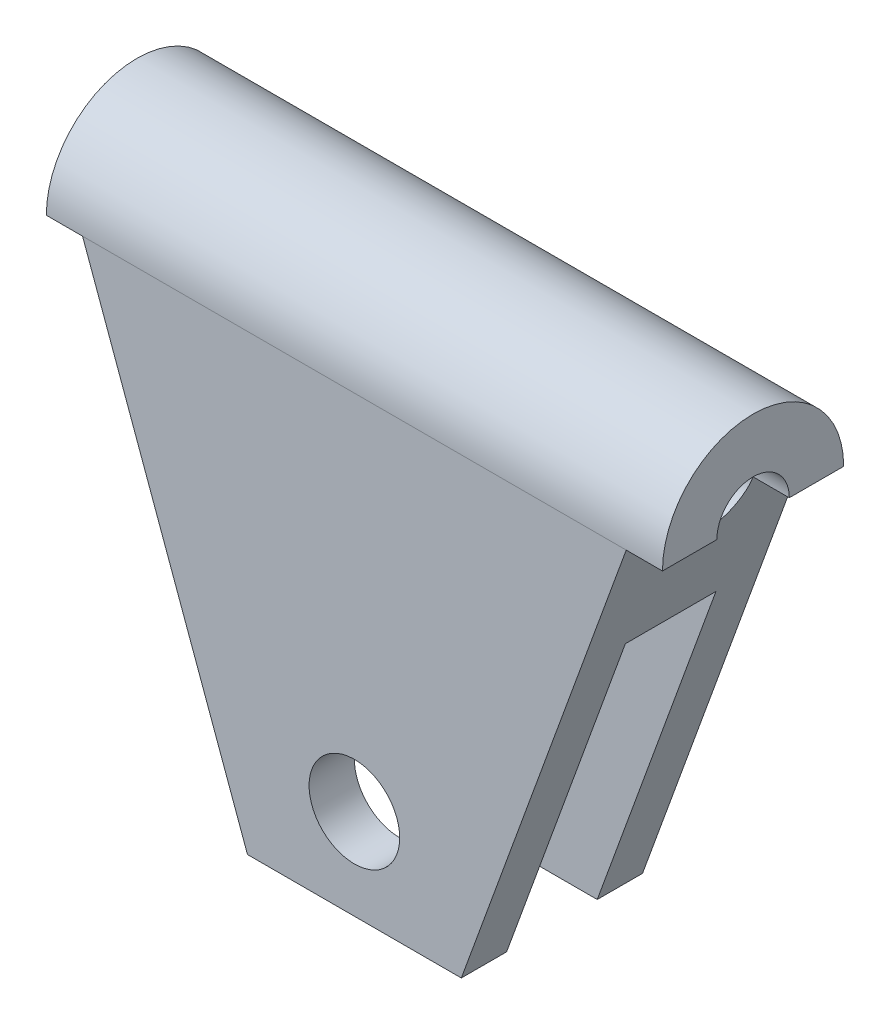
ISO-10303-21;
HEADER;
FILE_DESCRIPTION(('STEP AP214'),'2;1');
FILE_NAME('part.step','',(''),(''),'','','');
FILE_SCHEMA(('AUTOMOTIVE_DESIGN { 1 0 10303 214 1 1 1 1 }'));
ENDSEC;
DATA;
#1=APPLICATION_CONTEXT('core data for automotive mechanical design processes');
#2=APPLICATION_PROTOCOL_DEFINITION('international standard','automotive_design',2000,#1);
#3=PRODUCT_CONTEXT('',#1,'mechanical');
#4=PRODUCT('Part','Part','',(#3));
#5=PRODUCT_RELATED_PRODUCT_CATEGORY('part','',(#4));
#6=PRODUCT_DEFINITION_FORMATION('','',#4);
#7=PRODUCT_DEFINITION_CONTEXT('part definition',#1,'design');
#8=PRODUCT_DEFINITION('design','',#6,#7);
#9=PRODUCT_DEFINITION_SHAPE('','',#8);
#10=(LENGTH_UNIT() NAMED_UNIT(*) SI_UNIT(.MILLI.,.METRE.));
#11=(NAMED_UNIT(*) PLANE_ANGLE_UNIT() SI_UNIT($,.RADIAN.));
#12=(NAMED_UNIT(*) SI_UNIT($,.STERADIAN.) SOLID_ANGLE_UNIT());
#13=UNCERTAINTY_MEASURE_WITH_UNIT(LENGTH_MEASURE(1.E-05),#10,'distance_accuracy_value','');
#14=(GEOMETRIC_REPRESENTATION_CONTEXT(3) GLOBAL_UNCERTAINTY_ASSIGNED_CONTEXT((#13)) GLOBAL_UNIT_ASSIGNED_CONTEXT((#10,
#11,#12)) REPRESENTATION_CONTEXT('',''));
#15=CARTESIAN_POINT('',(0.,0.,0.));
#16=DIRECTION('',(0.,0.,1.));
#17=DIRECTION('',(1.,0.,0.));
#18=AXIS2_PLACEMENT_3D('',#15,#16,#17);
#19=CARTESIAN_POINT('',(209.007441433448,-250.,100.));
#20=DIRECTION('',(0.,1.,0.));
#21=DIRECTION('',(0.,0.,1.));
#22=AXIS2_PLACEMENT_3D('',#19,#20,#21);
#23=PLANE('',#22);
#24=DIRECTION('',(0.,0.,-1.));
#25=VECTOR('',#24,1.);
#26=CARTESIAN_POINT('',(90.9925585665518,-250.,100.));
#27=LINE('',#26,#25);
#28=CARTESIAN_POINT('',(90.9925585665518,-250.,100.));
#29=VERTEX_POINT('',#28);
#30=CARTESIAN_POINT('',(90.9925585665518,-250.,75.));
#31=VERTEX_POINT('',#30);
#32=EDGE_CURVE('E167',#29,#31,#27,.T.);
#33=ORIENTED_EDGE('',*,*,#32,.T.);
#34=DIRECTION('',(1.,0.,0.));
#35=VECTOR('',#34,1.);
#36=CARTESIAN_POINT('',(-20.,-250.,75.));
#37=LINE('',#36,#35);
#38=CARTESIAN_POINT('',(209.007441433448,-250.,75.));
#39=VERTEX_POINT('',#38);
#40=EDGE_CURVE('E162',#31,#39,#37,.T.);
#41=ORIENTED_EDGE('',*,*,#40,.T.);
#42=DIRECTION('',(0.,0.,-1.));
#43=VECTOR('',#42,1.);
#44=CARTESIAN_POINT('',(209.007441433448,-250.,100.));
#45=LINE('',#44,#43);
#46=CARTESIAN_POINT('',(209.007441433448,-250.,100.));
#47=VERTEX_POINT('',#46);
#48=EDGE_CURVE('E168',#47,#39,#45,.T.);
#49=ORIENTED_EDGE('',*,*,#48,.F.);
#50=DIRECTION('',(1.,0.,0.));
#51=VECTOR('',#50,1.);
#52=CARTESIAN_POINT('',(209.007441433448,-250.,100.));
#53=LINE('',#52,#51);
#54=EDGE_CURVE('E85',#29,#47,#53,.T.);
#55=ORIENTED_EDGE('',*,*,#54,.F.);
#56=EDGE_LOOP('',(#33,#41,#49,#55));
#57=FACE_BOUND('',#56,.T.);
#58=ADVANCED_FACE('F34',(#57),#23,.F.);
#59=CARTESIAN_POINT('',(90.9925585665518,-250.,100.));
#60=DIRECTION('',(0.939692620785907,0.342020143325673,0.));
#61=DIRECTION('',(-0.342020143325673,0.939692620785907,0.));
#62=AXIS2_PLACEMENT_3D('',#59,#60,#61);
#63=PLANE('',#62);
#64=DIRECTION('',(0.,0.,1.));
#65=VECTOR('',#64,1.);
#66=CARTESIAN_POINT('',(25.4779163986345,-70.,100.));
#67=LINE('',#66,#65);
#68=CARTESIAN_POINT('',(25.4779163986345,-70.,25.));
#69=VERTEX_POINT('',#68);
#70=CARTESIAN_POINT('',(25.4779163986345,-70.,75.));
#71=VERTEX_POINT('',#70);
#72=EDGE_CURVE('E152',#69,#71,#67,.T.);
#73=ORIENTED_EDGE('',*,*,#72,.T.);
#74=DIRECTION('',(0.342020143325673,-0.939692620785907,0.));
#75=VECTOR('',#74,1.);
#76=CARTESIAN_POINT('',(90.9925585665518,-250.,75.));
#77=LINE('',#76,#75);
#78=EDGE_CURVE('E186',#71,#31,#77,.T.);
#79=ORIENTED_EDGE('',*,*,#78,.T.);
#80=ORIENTED_EDGE('',*,*,#32,.F.);
#81=DIRECTION('',(0.342020143325673,-0.939692620785907,0.));
#82=VECTOR('',#81,1.);
#83=CARTESIAN_POINT('',(90.9925585665518,-250.,100.));
#84=LINE('',#83,#82);
#85=CARTESIAN_POINT('',(0.,0.,100.));
#86=VERTEX_POINT('',#85);
#87=EDGE_CURVE('E245',#86,#29,#84,.T.);
#88=ORIENTED_EDGE('',*,*,#87,.F.);
#89=DIRECTION('',(0.,0.,-1.));
#90=VECTOR('',#89,1.);
#91=CARTESIAN_POINT('',(0.,0.,100.));
#92=LINE('',#91,#90);
#93=CARTESIAN_POINT('',(0.,0.,70.));
#94=VERTEX_POINT('',#93);
#95=EDGE_CURVE('E252',#86,#94,#92,.T.);
#96=ORIENTED_EDGE('',*,*,#95,.T.);
#97=CARTESIAN_POINT('',(0.,0.,50.));
#98=DIRECTION('',(0.939692620785907,0.342020143325673,0.));
#99=DIRECTION('',(0.342020143325673,-0.939692620785907,0.));
#100=AXIS2_PLACEMENT_3D('',#97,#98,#99);
#101=ELLIPSE('',#100,21.2835554495183,20.);
#102=CARTESIAN_POINT('',(0.,0.,30.));
#103=VERTEX_POINT('',#102);
#104=EDGE_CURVE('E242',#94,#103,#101,.T.);
#105=ORIENTED_EDGE('',*,*,#104,.T.);
#106=DIRECTION('',(0.,0.,1.));
#107=VECTOR('',#106,1.);
#108=CARTESIAN_POINT('',(0.,0.,100.));
#109=LINE('',#108,#107);
#110=CARTESIAN_POINT('',(0.,0.,0.));
#111=VERTEX_POINT('',#110);
#112=EDGE_CURVE('E236',#111,#103,#109,.T.);
#113=ORIENTED_EDGE('',*,*,#112,.F.);
#114=DIRECTION('',(0.342020143325673,-0.939692620785907,0.));
#115=VECTOR('',#114,1.);
#116=CARTESIAN_POINT('',(90.9925585665518,-250.,0.));
#117=LINE('',#116,#115);
#118=CARTESIAN_POINT('',(90.9925585665518,-250.,0.));
#119=VERTEX_POINT('',#118);
#120=EDGE_CURVE('E166',#111,#119,#117,.T.);
#121=ORIENTED_EDGE('',*,*,#120,.T.);
#122=CARTESIAN_POINT('',(90.9925585665518,-250.,25.));
#123=VERTEX_POINT('',#122);
#124=EDGE_CURVE('E159',#123,#119,#27,.T.);
#125=ORIENTED_EDGE('',*,*,#124,.F.);
#126=DIRECTION('',(-0.342020143325673,0.939692620785907,0.));
#127=VECTOR('',#126,1.);
#128=CARTESIAN_POINT('',(90.9925585665518,-250.,25.));
#129=LINE('',#128,#127);
#130=EDGE_CURVE('E145',#123,#69,#129,.T.);
#131=ORIENTED_EDGE('',*,*,#130,.T.);
#132=EDGE_LOOP('',(#73,#79,#80,#88,#96,#105,#113,#121,#125,#131));
#133=FACE_BOUND('',#132,.T.);
#134=ADVANCED_FACE('F36',(#133),#63,.F.);
#135=CARTESIAN_POINT('',(209.007441433448,-250.,25.));
#136=VERTEX_POINT('',#135);
#137=CARTESIAN_POINT('',(209.007441433448,-250.,0.));
#138=VERTEX_POINT('',#137);
#139=EDGE_CURVE('E161',#136,#138,#45,.T.);
#140=ORIENTED_EDGE('',*,*,#139,.F.);
#141=DIRECTION('',(1.,0.,0.));
#142=VECTOR('',#141,1.);
#143=CARTESIAN_POINT('',(-20.,-250.,25.));
#144=LINE('',#143,#142);
#145=EDGE_CURVE('E50',#123,#136,#144,.T.);
#146=ORIENTED_EDGE('',*,*,#145,.F.);
#147=ORIENTED_EDGE('',*,*,#124,.T.);
#148=DIRECTION('',(1.,0.,0.));
#149=VECTOR('',#148,1.);
#150=CARTESIAN_POINT('',(209.007441433448,-250.,0.));
#151=LINE('',#150,#149);
#152=EDGE_CURVE('E254',#119,#138,#151,.T.);
#153=ORIENTED_EDGE('',*,*,#152,.T.);
#154=EDGE_LOOP('',(#140,#146,#147,#153));
#155=FACE_BOUND('',#154,.T.);
#156=ADVANCED_FACE('F157',(#155),#23,.F.);
#157=CARTESIAN_POINT('',(300.,0.,100.));
#158=DIRECTION('',(-0.939692620785907,0.342020143325673,0.));
#159=DIRECTION('',(-0.342020143325673,-0.939692620785907,0.));
#160=AXIS2_PLACEMENT_3D('',#157,#158,#159);
#161=PLANE('',#160);
#162=ORIENTED_EDGE('',*,*,#48,.T.);
#163=DIRECTION('',(0.342020143325673,0.939692620785907,0.));
#164=VECTOR('',#163,1.);
#165=CARTESIAN_POINT('',(300.,0.,75.));
#166=LINE('',#165,#164);
#167=CARTESIAN_POINT('',(274.522083601365,-70.,75.));
#168=VERTEX_POINT('',#167);
#169=EDGE_CURVE('E11',#39,#168,#166,.T.);
#170=ORIENTED_EDGE('',*,*,#169,.T.);
#171=DIRECTION('',(0.,0.,-1.));
#172=VECTOR('',#171,1.);
#173=CARTESIAN_POINT('',(274.522083601365,-70.,100.));
#174=LINE('',#173,#172);
#175=CARTESIAN_POINT('',(274.522083601365,-70.,25.));
#176=VERTEX_POINT('',#175);
#177=EDGE_CURVE('E43',#168,#176,#174,.T.);
#178=ORIENTED_EDGE('',*,*,#177,.T.);
#179=DIRECTION('',(-0.342020143325673,-0.939692620785907,0.));
#180=VECTOR('',#179,1.);
#181=CARTESIAN_POINT('',(300.,0.,25.));
#182=LINE('',#181,#180);
#183=EDGE_CURVE('E170',#176,#136,#182,.T.);
#184=ORIENTED_EDGE('',*,*,#183,.T.);
#185=ORIENTED_EDGE('',*,*,#139,.T.);
#186=DIRECTION('',(0.342020143325673,0.939692620785907,0.));
#187=VECTOR('',#186,1.);
#188=CARTESIAN_POINT('',(300.,0.,0.));
#189=LINE('',#188,#187);
#190=CARTESIAN_POINT('',(300.,0.,0.));
#191=VERTEX_POINT('',#190);
#192=EDGE_CURVE('E77',#138,#191,#189,.T.);
#193=ORIENTED_EDGE('',*,*,#192,.T.);
#194=DIRECTION('',(0.,0.,-1.));
#195=VECTOR('',#194,1.);
#196=CARTESIAN_POINT('',(300.,0.,100.));
#197=LINE('',#196,#195);
#198=CARTESIAN_POINT('',(300.,0.,30.));
#199=VERTEX_POINT('',#198);
#200=EDGE_CURVE('E222',#199,#191,#197,.T.);
#201=ORIENTED_EDGE('',*,*,#200,.F.);
#202=CARTESIAN_POINT('',(300.,0.,50.));
#203=DIRECTION('',(-0.939692620785907,0.342020143325673,0.));
#204=DIRECTION('',(0.342020143325673,0.939692620785907,0.));
#205=AXIS2_PLACEMENT_3D('',#202,#203,#204);
#206=ELLIPSE('',#205,21.2835554495183,20.);
#207=CARTESIAN_POINT('',(300.,0.,70.));
#208=VERTEX_POINT('',#207);
#209=EDGE_CURVE('E239',#199,#208,#206,.T.);
#210=ORIENTED_EDGE('',*,*,#209,.T.);
#211=DIRECTION('',(0.,0.,-1.));
#212=VECTOR('',#211,1.);
#213=CARTESIAN_POINT('',(300.,0.,100.));
#214=LINE('',#213,#212);
#215=CARTESIAN_POINT('',(300.,0.,100.));
#216=VERTEX_POINT('',#215);
#217=EDGE_CURVE('E260',#216,#208,#214,.T.);
#218=ORIENTED_EDGE('',*,*,#217,.F.);
#219=DIRECTION('',(0.342020143325673,0.939692620785907,0.));
#220=VECTOR('',#219,1.);
#221=CARTESIAN_POINT('',(300.,0.,100.));
#222=LINE('',#221,#220);
#223=EDGE_CURVE('E249',#47,#216,#222,.T.);
#224=ORIENTED_EDGE('',*,*,#223,.F.);
#225=EDGE_LOOP('',(#162,#170,#178,#184,#185,#193,#201,#210,#218,#224));
#226=FACE_BOUND('',#225,.T.);
#227=ADVANCED_FACE('F177',(#226),#161,.F.);
#228=CARTESIAN_POINT('',(0.,0.,100.));
#229=DIRECTION('',(0.,0.,-1.));
#230=DIRECTION('',(-1.,0.,0.));
#231=AXIS2_PLACEMENT_3D('',#228,#229,#230);
#232=PLANE('',#231);
#233=CARTESIAN_POINT('',(150.,-200.,100.));
#234=DIRECTION('',(0.,0.,1.));
#235=DIRECTION('',(1.,0.,0.));
#236=AXIS2_PLACEMENT_3D('',#233,#234,#235);
#237=CIRCLE('',#236,25.);
#238=CARTESIAN_POINT('',(175.,-200.,100.));
#239=VERTEX_POINT('',#238);
#240=EDGE_CURVE('E346',#239,#239,#237,.T.);
#241=ORIENTED_EDGE('',*,*,#240,.F.);
#242=EDGE_LOOP('',(#241));
#243=FACE_BOUND('',#242,.T.);
#244=ORIENTED_EDGE('',*,*,#87,.T.);
#245=ORIENTED_EDGE('',*,*,#54,.T.);
#246=ORIENTED_EDGE('',*,*,#223,.T.);
#247=DIRECTION('',(-1.,0.,0.));
#248=VECTOR('',#247,1.);
#249=CARTESIAN_POINT('',(0.,0.,100.));
#250=LINE('',#249,#248);
#251=EDGE_CURVE('E59',#216,#86,#250,.T.);
#252=ORIENTED_EDGE('',*,*,#251,.T.);
#253=EDGE_LOOP('',(#244,#245,#246,#252));
#254=FACE_BOUND('',#253,.T.);
#255=ADVANCED_FACE('F291',(#243,#254),#232,.F.);
#256=CARTESIAN_POINT('',(0.,0.,0.));
#257=DIRECTION('',(0.,0.,-1.));
#258=DIRECTION('',(-1.,0.,0.));
#259=AXIS2_PLACEMENT_3D('',#256,#257,#258);
#260=PLANE('',#259);
#261=CARTESIAN_POINT('',(150.,-200.,0.));
#262=DIRECTION('',(0.,0.,1.));
#263=DIRECTION('',(1.,0.,0.));
#264=AXIS2_PLACEMENT_3D('',#261,#262,#263);
#265=CIRCLE('',#264,25.);
#266=CARTESIAN_POINT('',(175.,-200.,0.));
#267=VERTEX_POINT('',#266);
#268=EDGE_CURVE('E352',#267,#267,#265,.T.);
#269=ORIENTED_EDGE('',*,*,#268,.T.);
#270=EDGE_LOOP('',(#269));
#271=FACE_BOUND('',#270,.T.);
#272=ORIENTED_EDGE('',*,*,#120,.F.);
#273=DIRECTION('',(-1.,0.,0.));
#274=VECTOR('',#273,1.);
#275=CARTESIAN_POINT('',(0.,0.,0.));
#276=LINE('',#275,#274);
#277=EDGE_CURVE('E247',#191,#111,#276,.T.);
#278=ORIENTED_EDGE('',*,*,#277,.F.);
#279=ORIENTED_EDGE('',*,*,#192,.F.);
#280=ORIENTED_EDGE('',*,*,#152,.F.);
#281=EDGE_LOOP('',(#272,#278,#279,#280));
#282=FACE_BOUND('',#281,.T.);
#283=ADVANCED_FACE('F267',(#271,#282),#260,.T.);
#284=CARTESIAN_POINT('',(-20.,0.,0.));
#285=DIRECTION('',(0.,1.,0.));
#286=DIRECTION('',(0.,0.,1.));
#287=AXIS2_PLACEMENT_3D('',#284,#285,#286);
#288=PLANE('',#287);
#289=DIRECTION('',(1.,0.,0.));
#290=VECTOR('',#289,1.);
#291=CARTESIAN_POINT('',(-20.,0.,70.));
#292=LINE('',#291,#290);
#293=CARTESIAN_POINT('',(-20.,0.,70.));
#294=VERTEX_POINT('',#293);
#295=EDGE_CURVE('E231',#294,#94,#292,.T.);
#296=ORIENTED_EDGE('',*,*,#295,.T.);
#297=ORIENTED_EDGE('',*,*,#95,.F.);
#298=DIRECTION('',(1.,0.,0.));
#299=VECTOR('',#298,1.);
#300=CARTESIAN_POINT('',(-20.,0.,100.));
#301=LINE('',#300,#299);
#302=CARTESIAN_POINT('',(-20.,0.,100.));
#303=VERTEX_POINT('',#302);
#304=EDGE_CURVE('E219',#303,#86,#301,.T.);
#305=ORIENTED_EDGE('',*,*,#304,.F.);
#306=DIRECTION('',(0.,0.,1.));
#307=VECTOR('',#306,1.);
#308=CARTESIAN_POINT('',(-20.,0.,0.));
#309=LINE('',#308,#307);
#310=EDGE_CURVE('E210',#294,#303,#309,.T.);
#311=ORIENTED_EDGE('',*,*,#310,.F.);
#312=EDGE_LOOP('',(#296,#297,#305,#311));
#313=FACE_BOUND('',#312,.T.);
#314=ADVANCED_FACE('F289',(#313),#288,.F.);
#315=CARTESIAN_POINT('',(320.,0.,100.));
#316=VERTEX_POINT('',#315);
#317=EDGE_CURVE('E223',#216,#316,#301,.T.);
#318=ORIENTED_EDGE('',*,*,#317,.F.);
#319=ORIENTED_EDGE('',*,*,#217,.T.);
#320=CARTESIAN_POINT('',(320.,0.,70.));
#321=VERTEX_POINT('',#320);
#322=EDGE_CURVE('E218',#208,#321,#292,.T.);
#323=ORIENTED_EDGE('',*,*,#322,.T.);
#324=DIRECTION('',(0.,0.,1.));
#325=VECTOR('',#324,1.);
#326=CARTESIAN_POINT('',(320.,0.,0.));
#327=LINE('',#326,#325);
#328=EDGE_CURVE('E201',#321,#316,#327,.T.);
#329=ORIENTED_EDGE('',*,*,#328,.T.);
#330=EDGE_LOOP('',(#318,#319,#323,#329));
#331=FACE_BOUND('',#330,.T.);
#332=ADVANCED_FACE('F283',(#331),#288,.F.);
#333=CARTESIAN_POINT('',(-20.,0.,0.));
#334=DIRECTION('',(0.,1.,0.));
#335=DIRECTION('',(0.,0.,1.));
#336=AXIS2_PLACEMENT_3D('',#333,#334,#335);
#337=PLANE('',#336);
#338=DIRECTION('',(1.,0.,0.));
#339=VECTOR('',#338,1.);
#340=CARTESIAN_POINT('',(-20.,0.,0.));
#341=LINE('',#340,#339);
#342=CARTESIAN_POINT('',(-20.,0.,0.));
#343=VERTEX_POINT('',#342);
#344=EDGE_CURVE('E224',#343,#111,#341,.T.);
#345=ORIENTED_EDGE('',*,*,#344,.T.);
#346=ORIENTED_EDGE('',*,*,#112,.T.);
#347=DIRECTION('',(1.,0.,0.));
#348=VECTOR('',#347,1.);
#349=CARTESIAN_POINT('',(-20.,0.,30.));
#350=LINE('',#349,#348);
#351=CARTESIAN_POINT('',(-20.,0.,30.));
#352=VERTEX_POINT('',#351);
#353=EDGE_CURVE('E228',#352,#103,#350,.T.);
#354=ORIENTED_EDGE('',*,*,#353,.F.);
#355=DIRECTION('',(0.,0.,1.));
#356=VECTOR('',#355,1.);
#357=CARTESIAN_POINT('',(-20.,0.,0.));
#358=LINE('',#357,#356);
#359=EDGE_CURVE('E212',#343,#352,#358,.T.);
#360=ORIENTED_EDGE('',*,*,#359,.F.);
#361=EDGE_LOOP('',(#345,#346,#354,#360));
#362=FACE_BOUND('',#361,.T.);
#363=ADVANCED_FACE('F313',(#362),#337,.F.);
#364=CARTESIAN_POINT('',(320.,0.,30.));
#365=VERTEX_POINT('',#364);
#366=EDGE_CURVE('E230',#199,#365,#350,.T.);
#367=ORIENTED_EDGE('',*,*,#366,.F.);
#368=ORIENTED_EDGE('',*,*,#200,.T.);
#369=CARTESIAN_POINT('',(320.,0.,0.));
#370=VERTEX_POINT('',#369);
#371=EDGE_CURVE('E227',#191,#370,#341,.T.);
#372=ORIENTED_EDGE('',*,*,#371,.T.);
#373=DIRECTION('',(0.,0.,1.));
#374=VECTOR('',#373,1.);
#375=CARTESIAN_POINT('',(320.,0.,0.));
#376=LINE('',#375,#374);
#377=EDGE_CURVE('E204',#370,#365,#376,.T.);
#378=ORIENTED_EDGE('',*,*,#377,.T.);
#379=EDGE_LOOP('',(#367,#368,#372,#378));
#380=FACE_BOUND('',#379,.T.);
#381=ADVANCED_FACE('F272',(#380),#337,.F.);
#382=CARTESIAN_POINT('',(-20.,0.,50.));
#383=DIRECTION('',(1.,0.,0.));
#384=DIRECTION('',(0.,0.,-1.));
#385=AXIS2_PLACEMENT_3D('',#382,#383,#384);
#386=CYLINDRICAL_SURFACE('',#385,50.);
#387=ORIENTED_EDGE('',*,*,#304,.T.);
#388=ORIENTED_EDGE('',*,*,#251,.F.);
#389=ORIENTED_EDGE('',*,*,#317,.T.);
#390=CARTESIAN_POINT('',(320.,0.,50.));
#391=DIRECTION('',(1.,0.,0.));
#392=DIRECTION('',(0.,0.,-1.));
#393=AXIS2_PLACEMENT_3D('',#390,#391,#392);
#394=CIRCLE('',#393,50.);
#395=EDGE_CURVE('E207',#370,#316,#394,.T.);
#396=ORIENTED_EDGE('',*,*,#395,.F.);
#397=ORIENTED_EDGE('',*,*,#371,.F.);
#398=ORIENTED_EDGE('',*,*,#277,.T.);
#399=ORIENTED_EDGE('',*,*,#344,.F.);
#400=CARTESIAN_POINT('',(-20.,0.,50.));
#401=DIRECTION('',(1.,0.,0.));
#402=DIRECTION('',(0.,0.,-1.));
#403=AXIS2_PLACEMENT_3D('',#400,#401,#402);
#404=CIRCLE('',#403,50.);
#405=EDGE_CURVE('E215',#343,#303,#404,.T.);
#406=ORIENTED_EDGE('',*,*,#405,.T.);
#407=EDGE_LOOP('',(#387,#388,#389,#396,#397,#398,#399,#406));
#408=FACE_BOUND('',#407,.T.);
#409=ADVANCED_FACE('F274',(#408),#386,.T.);
#410=CARTESIAN_POINT('',(-20.,0.,0.));
#411=DIRECTION('',(1.,0.,0.));
#412=DIRECTION('',(0.,0.,-1.));
#413=AXIS2_PLACEMENT_3D('',#410,#411,#412);
#414=PLANE('',#413);
#415=CARTESIAN_POINT('',(-20.,0.,50.));
#416=DIRECTION('',(1.,0.,0.));
#417=DIRECTION('',(0.,0.,-1.));
#418=AXIS2_PLACEMENT_3D('',#415,#416,#417);
#419=CIRCLE('',#418,20.);
#420=EDGE_CURVE('E196',#352,#294,#419,.T.);
#421=ORIENTED_EDGE('',*,*,#420,.T.);
#422=ORIENTED_EDGE('',*,*,#310,.T.);
#423=ORIENTED_EDGE('',*,*,#405,.F.);
#424=ORIENTED_EDGE('',*,*,#359,.T.);
#425=EDGE_LOOP('',(#421,#422,#423,#424));
#426=FACE_BOUND('',#425,.T.);
#427=ADVANCED_FACE('F319',(#426),#414,.F.);
#428=CARTESIAN_POINT('',(320.,0.,0.));
#429=DIRECTION('',(1.,0.,0.));
#430=DIRECTION('',(0.,0.,-1.));
#431=AXIS2_PLACEMENT_3D('',#428,#429,#430);
#432=PLANE('',#431);
#433=ORIENTED_EDGE('',*,*,#328,.F.);
#434=CARTESIAN_POINT('',(320.,0.,50.));
#435=DIRECTION('',(1.,0.,0.));
#436=DIRECTION('',(0.,0.,-1.));
#437=AXIS2_PLACEMENT_3D('',#434,#435,#436);
#438=CIRCLE('',#437,20.);
#439=EDGE_CURVE('E199',#365,#321,#438,.T.);
#440=ORIENTED_EDGE('',*,*,#439,.F.);
#441=ORIENTED_EDGE('',*,*,#377,.F.);
#442=ORIENTED_EDGE('',*,*,#395,.T.);
#443=EDGE_LOOP('',(#433,#440,#441,#442));
#444=FACE_BOUND('',#443,.T.);
#445=ADVANCED_FACE('F279',(#444),#432,.T.);
#446=CARTESIAN_POINT('',(320.,0.,50.));
#447=DIRECTION('',(-1.,0.,0.));
#448=DIRECTION('',(0.,0.,1.));
#449=AXIS2_PLACEMENT_3D('',#446,#447,#448);
#450=CYLINDRICAL_SURFACE('',#449,20.);
#451=ORIENTED_EDGE('',*,*,#322,.F.);
#452=ORIENTED_EDGE('',*,*,#209,.F.);
#453=ORIENTED_EDGE('',*,*,#366,.T.);
#454=ORIENTED_EDGE('',*,*,#439,.T.);
#455=EDGE_LOOP('',(#451,#452,#453,#454));
#456=FACE_BOUND('',#455,.T.);
#457=ORIENTED_EDGE('',*,*,#295,.F.);
#458=ORIENTED_EDGE('',*,*,#420,.F.);
#459=ORIENTED_EDGE('',*,*,#353,.T.);
#460=ORIENTED_EDGE('',*,*,#104,.F.);
#461=EDGE_LOOP('',(#457,#458,#459,#460));
#462=FACE_BOUND('',#461,.T.);
#463=ADVANCED_FACE('F281',(#456,#462),#450,.F.);
#464=CARTESIAN_POINT('',(-20.,-250.,75.));
#465=DIRECTION('',(0.,0.,1.));
#466=DIRECTION('',(1.,0.,0.));
#467=AXIS2_PLACEMENT_3D('',#464,#465,#466);
#468=PLANE('',#467);
#469=CARTESIAN_POINT('',(150.,-200.,75.));
#470=DIRECTION('',(0.,0.,1.));
#471=DIRECTION('',(1.,0.,0.));
#472=AXIS2_PLACEMENT_3D('',#469,#470,#471);
#473=CIRCLE('',#472,25.);
#474=CARTESIAN_POINT('',(175.,-200.,75.));
#475=VERTEX_POINT('',#474);
#476=EDGE_CURVE('E190',#475,#475,#473,.F.);
#477=ORIENTED_EDGE('',*,*,#476,.F.);
#478=EDGE_LOOP('',(#477));
#479=FACE_BOUND('',#478,.T.);
#480=DIRECTION('',(1.,0.,0.));
#481=VECTOR('',#480,1.);
#482=CARTESIAN_POINT('',(-20.,-70.,75.));
#483=LINE('',#482,#481);
#484=EDGE_CURVE('E153',#71,#168,#483,.T.);
#485=ORIENTED_EDGE('',*,*,#484,.T.);
#486=ORIENTED_EDGE('',*,*,#169,.F.);
#487=ORIENTED_EDGE('',*,*,#40,.F.);
#488=ORIENTED_EDGE('',*,*,#78,.F.);
#489=EDGE_LOOP('',(#485,#486,#487,#488));
#490=FACE_BOUND('',#489,.T.);
#491=ADVANCED_FACE('F183',(#479,#490),#468,.F.);
#492=CARTESIAN_POINT('',(-20.,-70.,75.));
#493=DIRECTION('',(0.,1.,0.));
#494=DIRECTION('',(0.,0.,1.));
#495=AXIS2_PLACEMENT_3D('',#492,#493,#494);
#496=PLANE('',#495);
#497=DIRECTION('',(1.,0.,0.));
#498=VECTOR('',#497,1.);
#499=CARTESIAN_POINT('',(-20.,-70.,25.));
#500=LINE('',#499,#498);
#501=EDGE_CURVE('E148',#69,#176,#500,.T.);
#502=ORIENTED_EDGE('',*,*,#501,.T.);
#503=ORIENTED_EDGE('',*,*,#177,.F.);
#504=ORIENTED_EDGE('',*,*,#484,.F.);
#505=ORIENTED_EDGE('',*,*,#72,.F.);
#506=EDGE_LOOP('',(#502,#503,#504,#505));
#507=FACE_BOUND('',#506,.T.);
#508=ADVANCED_FACE('F181',(#507),#496,.F.);
#509=CARTESIAN_POINT('',(-20.,-250.,25.));
#510=DIRECTION('',(0.,0.,-1.));
#511=DIRECTION('',(0.,1.,0.));
#512=AXIS2_PLACEMENT_3D('',#509,#510,#511);
#513=PLANE('',#512);
#514=CARTESIAN_POINT('',(150.,-200.,25.));
#515=DIRECTION('',(0.,0.,-1.));
#516=DIRECTION('',(0.,1.,0.));
#517=AXIS2_PLACEMENT_3D('',#514,#515,#516);
#518=CIRCLE('',#517,25.);
#519=CARTESIAN_POINT('',(150.,-175.,25.));
#520=VERTEX_POINT('',#519);
#521=EDGE_CURVE('E38',#520,#520,#518,.F.);
#522=ORIENTED_EDGE('',*,*,#521,.F.);
#523=EDGE_LOOP('',(#522));
#524=FACE_BOUND('',#523,.T.);
#525=ORIENTED_EDGE('',*,*,#145,.T.);
#526=ORIENTED_EDGE('',*,*,#183,.F.);
#527=ORIENTED_EDGE('',*,*,#501,.F.);
#528=ORIENTED_EDGE('',*,*,#130,.F.);
#529=EDGE_LOOP('',(#525,#526,#527,#528));
#530=FACE_BOUND('',#529,.T.);
#531=ADVANCED_FACE('F146',(#524,#530),#513,.F.);
#532=CARTESIAN_POINT('',(150.,-200.,100.));
#533=DIRECTION('',(0.,0.,-1.));
#534=DIRECTION('',(-1.,0.,0.));
#535=AXIS2_PLACEMENT_3D('',#532,#533,#534);
#536=CYLINDRICAL_SURFACE('',#535,25.);
#537=ORIENTED_EDGE('',*,*,#268,.F.);
#538=EDGE_LOOP('',(#537));
#539=FACE_BOUND('',#538,.T.);
#540=ORIENTED_EDGE('',*,*,#521,.T.);
#541=EDGE_LOOP('',(#540));
#542=FACE_BOUND('',#541,.T.);
#543=ADVANCED_FACE('F332',(#539,#542),#536,.F.);
#544=ORIENTED_EDGE('',*,*,#240,.T.);
#545=EDGE_LOOP('',(#544));
#546=FACE_BOUND('',#545,.T.);
#547=ORIENTED_EDGE('',*,*,#476,.T.);
#548=EDGE_LOOP('',(#547));
#549=FACE_BOUND('',#548,.T.);
#550=ADVANCED_FACE('F336',(#546,#549),#536,.F.);
#551=CLOSED_SHELL('',(#58,#134,#156,#227,#255,#283,#314,#332,#363,#381,#409,#427,#445,#463,#491,
#508,#531,#543,#550));
#552=MANIFOLD_SOLID_BREP('B2',#551);
#553=ADVANCED_BREP_SHAPE_REPRESENTATION('',(#18,#552),#14);
#554=SHAPE_DEFINITION_REPRESENTATION(#9,#553);
ENDSEC;
END-ISO-10303-21;
